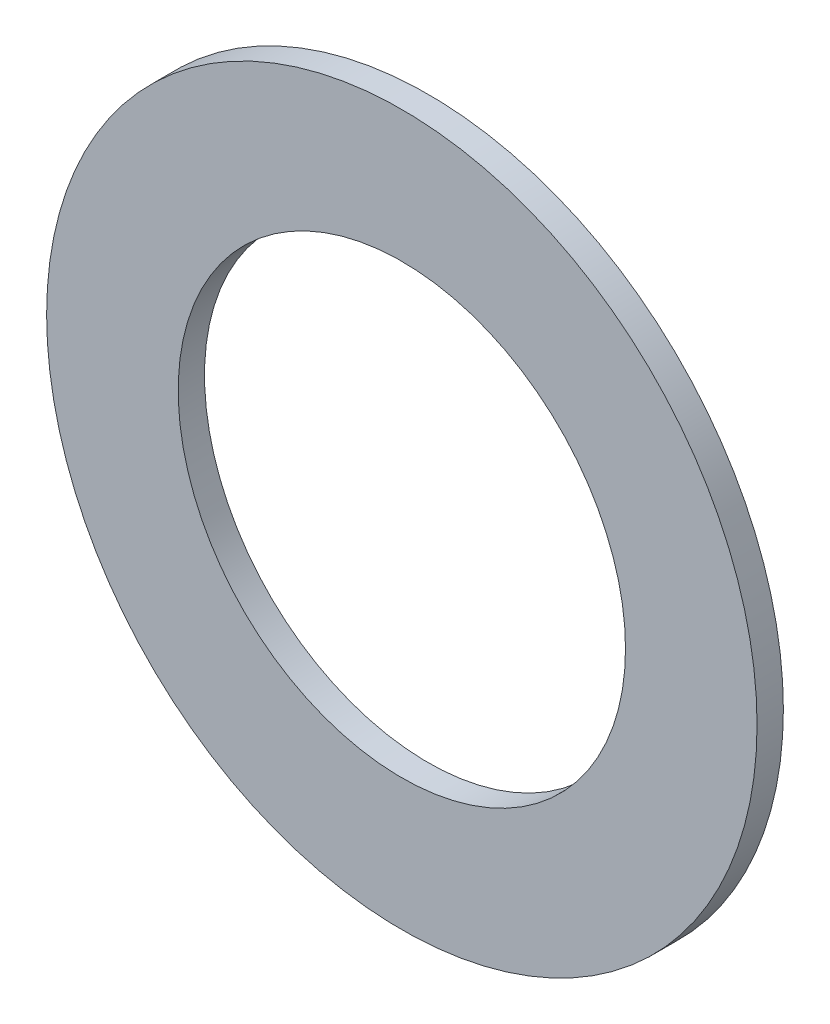
ISO-10303-21;
HEADER;
FILE_DESCRIPTION(('STEP AP214'),'2;1');
FILE_NAME('part.step','',(''),(''),'','','');
FILE_SCHEMA(('AUTOMOTIVE_DESIGN { 1 0 10303 214 1 1 1 1 }'));
ENDSEC;
DATA;
#1=APPLICATION_CONTEXT('core data for automotive mechanical design processes');
#2=APPLICATION_PROTOCOL_DEFINITION('international standard','automotive_design',2000,#1);
#3=PRODUCT_CONTEXT('',#1,'mechanical');
#4=PRODUCT('Part','Part','',(#3));
#5=PRODUCT_RELATED_PRODUCT_CATEGORY('part','',(#4));
#6=PRODUCT_DEFINITION_FORMATION('','',#4);
#7=PRODUCT_DEFINITION_CONTEXT('part definition',#1,'design');
#8=PRODUCT_DEFINITION('design','',#6,#7);
#9=PRODUCT_DEFINITION_SHAPE('','',#8);
#10=(LENGTH_UNIT() NAMED_UNIT(*) SI_UNIT(.MILLI.,.METRE.));
#11=(NAMED_UNIT(*) PLANE_ANGLE_UNIT() SI_UNIT($,.RADIAN.));
#12=(NAMED_UNIT(*) SI_UNIT($,.STERADIAN.) SOLID_ANGLE_UNIT());
#13=UNCERTAINTY_MEASURE_WITH_UNIT(LENGTH_MEASURE(1.E-05),#10,'distance_accuracy_value','');
#14=(GEOMETRIC_REPRESENTATION_CONTEXT(3) GLOBAL_UNCERTAINTY_ASSIGNED_CONTEXT((#13)) GLOBAL_UNIT_ASSIGNED_CONTEXT((#10,
#11,#12)) REPRESENTATION_CONTEXT('',''));
#15=CARTESIAN_POINT('',(0.,0.,0.));
#16=DIRECTION('',(0.,0.,1.));
#17=DIRECTION('',(1.,0.,0.));
#18=AXIS2_PLACEMENT_3D('',#15,#16,#17);
#19=CARTESIAN_POINT('',(0.,0.,1.));
#20=DIRECTION('',(0.,0.,1.));
#21=DIRECTION('',(1.,0.,0.));
#22=AXIS2_PLACEMENT_3D('',#19,#20,#21);
#23=PLANE('',#22);
#24=CARTESIAN_POINT('',(0.,0.,1.));
#25=DIRECTION('',(0.,0.,1.));
#26=DIRECTION('',(1.,0.,0.));
#27=AXIS2_PLACEMENT_3D('',#24,#25,#26);
#28=CIRCLE('',#27,13.5);
#29=CARTESIAN_POINT('',(13.5,0.,1.));
#30=VERTEX_POINT('',#29);
#31=EDGE_CURVE('E10',#30,#30,#28,.T.);
#32=ORIENTED_EDGE('',*,*,#31,.T.);
#33=EDGE_LOOP('',(#32));
#34=FACE_BOUND('',#33,.T.);
#35=CARTESIAN_POINT('',(0.,0.,1.));
#36=DIRECTION('',(0.,0.,1.));
#37=DIRECTION('',(1.,0.,0.));
#38=AXIS2_PLACEMENT_3D('',#35,#36,#37);
#39=CIRCLE('',#38,8.5);
#40=CARTESIAN_POINT('',(8.5,0.,1.));
#41=VERTEX_POINT('',#40);
#42=EDGE_CURVE('E45',#41,#41,#39,.T.);
#43=ORIENTED_EDGE('',*,*,#42,.F.);
#44=EDGE_LOOP('',(#43));
#45=FACE_BOUND('',#44,.T.);
#46=ADVANCED_FACE('F34',(#34,#45),#23,.T.);
#47=CARTESIAN_POINT('',(0.,0.,0.));
#48=DIRECTION('',(0.,0.,1.));
#49=DIRECTION('',(1.,0.,0.));
#50=AXIS2_PLACEMENT_3D('',#47,#48,#49);
#51=PLANE('',#50);
#52=CARTESIAN_POINT('',(0.,0.,0.));
#53=DIRECTION('',(0.,0.,1.));
#54=DIRECTION('',(1.,0.,0.));
#55=AXIS2_PLACEMENT_3D('',#52,#53,#54);
#56=CIRCLE('',#55,13.5);
#57=CARTESIAN_POINT('',(13.5,0.,0.));
#58=VERTEX_POINT('',#57);
#59=EDGE_CURVE('E38',#58,#58,#56,.T.);
#60=ORIENTED_EDGE('',*,*,#59,.F.);
#61=EDGE_LOOP('',(#60));
#62=FACE_BOUND('',#61,.T.);
#63=CARTESIAN_POINT('',(0.,0.,0.));
#64=DIRECTION('',(0.,0.,1.));
#65=DIRECTION('',(1.,0.,0.));
#66=AXIS2_PLACEMENT_3D('',#63,#64,#65);
#67=CIRCLE('',#66,8.5);
#68=CARTESIAN_POINT('',(8.5,0.,0.));
#69=VERTEX_POINT('',#68);
#70=EDGE_CURVE('E47',#69,#69,#67,.T.);
#71=ORIENTED_EDGE('',*,*,#70,.T.);
#72=EDGE_LOOP('',(#71));
#73=FACE_BOUND('',#72,.T.);
#74=ADVANCED_FACE('F57',(#62,#73),#51,.F.);
#75=CARTESIAN_POINT('',(0.,0.,1.));
#76=DIRECTION('',(0.,0.,-1.));
#77=DIRECTION('',(-1.,0.,0.));
#78=AXIS2_PLACEMENT_3D('',#75,#76,#77);
#79=CYLINDRICAL_SURFACE('',#78,13.5);
#80=ORIENTED_EDGE('',*,*,#31,.F.);
#81=EDGE_LOOP('',(#80));
#82=FACE_BOUND('',#81,.T.);
#83=ORIENTED_EDGE('',*,*,#59,.T.);
#84=EDGE_LOOP('',(#83));
#85=FACE_BOUND('',#84,.T.);
#86=ADVANCED_FACE('F36',(#82,#85),#79,.T.);
#87=CARTESIAN_POINT('',(0.,0.,1.));
#88=DIRECTION('',(0.,0.,-1.));
#89=DIRECTION('',(-1.,0.,0.));
#90=AXIS2_PLACEMENT_3D('',#87,#88,#89);
#91=CYLINDRICAL_SURFACE('',#90,8.5);
#92=ORIENTED_EDGE('',*,*,#42,.T.);
#93=EDGE_LOOP('',(#92));
#94=FACE_BOUND('',#93,.T.);
#95=ORIENTED_EDGE('',*,*,#70,.F.);
#96=EDGE_LOOP('',(#95));
#97=FACE_BOUND('',#96,.T.);
#98=ADVANCED_FACE('F53',(#94,#97),#91,.F.);
#99=CLOSED_SHELL('',(#46,#74,#86,#98));
#100=MANIFOLD_SOLID_BREP('B2',#99);
#101=ADVANCED_BREP_SHAPE_REPRESENTATION('',(#18,#100),#14);
#102=SHAPE_DEFINITION_REPRESENTATION(#9,#101);
ENDSEC;
END-ISO-10303-21;
